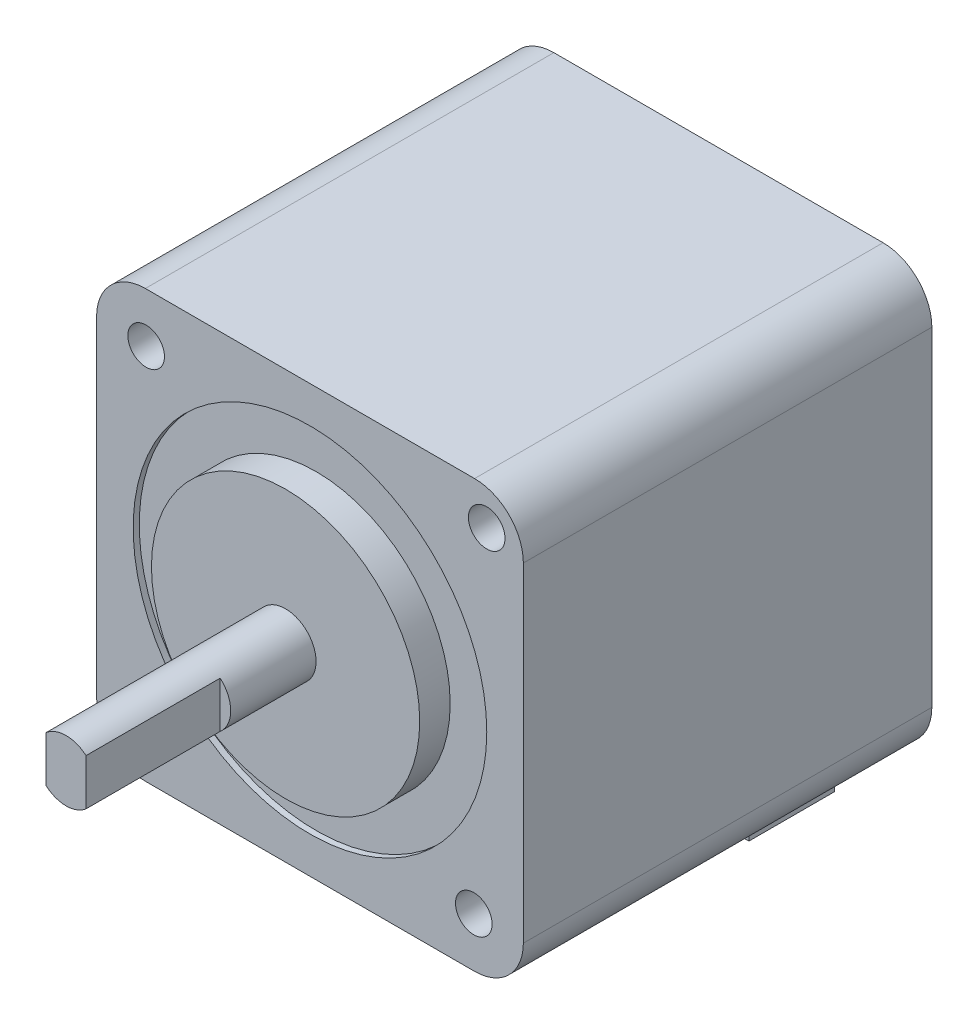
ISO-10303-21;
HEADER;
FILE_DESCRIPTION(('STEP AP214'),'2;1');
FILE_NAME('part.step','',(''),(''),'','','');
FILE_SCHEMA(('AUTOMOTIVE_DESIGN { 1 0 10303 214 1 1 1 1 }'));
ENDSEC;
DATA;
#1=APPLICATION_CONTEXT('core data for automotive mechanical design processes');
#2=APPLICATION_PROTOCOL_DEFINITION('international standard','automotive_design',2000,#1);
#3=PRODUCT_CONTEXT('',#1,'mechanical');
#4=PRODUCT('Part','Part','',(#3));
#5=PRODUCT_RELATED_PRODUCT_CATEGORY('part','',(#4));
#6=PRODUCT_DEFINITION_FORMATION('','',#4);
#7=PRODUCT_DEFINITION_CONTEXT('part definition',#1,'design');
#8=PRODUCT_DEFINITION('design','',#6,#7);
#9=PRODUCT_DEFINITION_SHAPE('','',#8);
#10=(LENGTH_UNIT() NAMED_UNIT(*) SI_UNIT(.MILLI.,.METRE.));
#11=(NAMED_UNIT(*) PLANE_ANGLE_UNIT() SI_UNIT($,.RADIAN.));
#12=(NAMED_UNIT(*) SI_UNIT($,.STERADIAN.) SOLID_ANGLE_UNIT());
#13=UNCERTAINTY_MEASURE_WITH_UNIT(LENGTH_MEASURE(1.E-05),#10,'distance_accuracy_value','');
#14=(GEOMETRIC_REPRESENTATION_CONTEXT(3) GLOBAL_UNCERTAINTY_ASSIGNED_CONTEXT((#13)) GLOBAL_UNIT_ASSIGNED_CONTEXT((#10,
#11,#12)) REPRESENTATION_CONTEXT('',''));
#15=CARTESIAN_POINT('',(0.,0.,0.));
#16=DIRECTION('',(0.,0.,1.));
#17=DIRECTION('',(1.,0.,0.));
#18=AXIS2_PLACEMENT_3D('',#15,#16,#17);
#19=CARTESIAN_POINT('',(-17.5,-17.5,33.5));
#20=DIRECTION('',(0.,1.,0.));
#21=DIRECTION('',(0.,0.,1.));
#22=AXIS2_PLACEMENT_3D('',#19,#20,#21);
#23=PLANE('',#22);
#24=DIRECTION('',(1.,0.,0.));
#25=VECTOR('',#24,1.);
#26=CARTESIAN_POINT('',(-17.5,-17.5,0.));
#27=LINE('',#26,#25);
#28=CARTESIAN_POINT('',(-13.5,-17.5,0.));
#29=VERTEX_POINT('',#28);
#30=CARTESIAN_POINT('',(13.5,-17.5,0.));
#31=VERTEX_POINT('',#30);
#32=EDGE_CURVE('E245',#29,#31,#27,.T.);
#33=ORIENTED_EDGE('',*,*,#32,.T.);
#34=DIRECTION('',(0.,0.,-1.));
#35=VECTOR('',#34,1.);
#36=CARTESIAN_POINT('',(13.5,-17.5,33.5));
#37=LINE('',#36,#35);
#38=CARTESIAN_POINT('',(13.5,-17.5,33.5));
#39=VERTEX_POINT('',#38);
#40=EDGE_CURVE('E11',#31,#39,#37,.F.);
#41=ORIENTED_EDGE('',*,*,#40,.T.);
#42=DIRECTION('',(1.,0.,0.));
#43=VECTOR('',#42,1.);
#44=CARTESIAN_POINT('',(-17.5,-17.5,33.5));
#45=LINE('',#44,#43);
#46=CARTESIAN_POINT('',(-13.5,-17.5,33.5));
#47=VERTEX_POINT('',#46);
#48=EDGE_CURVE('E251',#47,#39,#45,.T.);
#49=ORIENTED_EDGE('',*,*,#48,.F.);
#50=DIRECTION('',(0.,0.,-1.));
#51=VECTOR('',#50,1.);
#52=CARTESIAN_POINT('',(-13.5,-17.5,33.5));
#53=LINE('',#52,#51);
#54=EDGE_CURVE('E42',#47,#29,#53,.T.);
#55=ORIENTED_EDGE('',*,*,#54,.T.);
#56=EDGE_LOOP('',(#33,#41,#49,#55));
#57=FACE_BOUND('',#56,.T.);
#58=DIRECTION('',(0.,0.,1.));
#59=VECTOR('',#58,1.);
#60=CARTESIAN_POINT('',(10.5,-17.5,8.));
#61=LINE('',#60,#59);
#62=CARTESIAN_POINT('',(10.5,-17.5,1.));
#63=VERTEX_POINT('',#62);
#64=CARTESIAN_POINT('',(10.5,-17.5,8.));
#65=VERTEX_POINT('',#64);
#66=EDGE_CURVE('E166',#63,#65,#61,.T.);
#67=ORIENTED_EDGE('',*,*,#66,.F.);
#68=DIRECTION('',(1.,0.,0.));
#69=VECTOR('',#68,1.);
#70=CARTESIAN_POINT('',(-10.5,-17.5,1.));
#71=LINE('',#70,#69);
#72=CARTESIAN_POINT('',(-10.5,-17.5,1.));
#73=VERTEX_POINT('',#72);
#74=EDGE_CURVE('E163',#73,#63,#71,.T.);
#75=ORIENTED_EDGE('',*,*,#74,.F.);
#76=DIRECTION('',(0.,0.,-1.));
#77=VECTOR('',#76,1.);
#78=CARTESIAN_POINT('',(-10.5,-17.5,8.));
#79=LINE('',#78,#77);
#80=CARTESIAN_POINT('',(-10.5,-17.5,8.));
#81=VERTEX_POINT('',#80);
#82=EDGE_CURVE('E54',#81,#73,#79,.T.);
#83=ORIENTED_EDGE('',*,*,#82,.F.);
#84=DIRECTION('',(-1.,0.,0.));
#85=VECTOR('',#84,1.);
#86=CARTESIAN_POINT('',(-10.5,-17.5,8.));
#87=LINE('',#86,#85);
#88=EDGE_CURVE('E49',#65,#81,#87,.T.);
#89=ORIENTED_EDGE('',*,*,#88,.F.);
#90=EDGE_LOOP('',(#67,#75,#83,#89));
#91=FACE_BOUND('',#90,.T.);
#92=ADVANCED_FACE('F34',(#57,#91),#23,.F.);
#93=CARTESIAN_POINT('',(17.5,17.5,33.5));
#94=DIRECTION('',(-1.,0.,0.));
#95=DIRECTION('',(0.,-1.,0.));
#96=AXIS2_PLACEMENT_3D('',#93,#94,#95);
#97=PLANE('',#96);
#98=DIRECTION('',(0.,1.,0.));
#99=VECTOR('',#98,1.);
#100=CARTESIAN_POINT('',(17.5,17.5,0.));
#101=LINE('',#100,#99);
#102=CARTESIAN_POINT('',(17.5,-13.5,0.));
#103=VERTEX_POINT('',#102);
#104=CARTESIAN_POINT('',(17.5,13.5,0.));
#105=VERTEX_POINT('',#104);
#106=EDGE_CURVE('E240',#103,#105,#101,.T.);
#107=ORIENTED_EDGE('',*,*,#106,.T.);
#108=DIRECTION('',(0.,0.,-1.));
#109=VECTOR('',#108,1.);
#110=CARTESIAN_POINT('',(17.5,13.5,33.5));
#111=LINE('',#110,#109);
#112=CARTESIAN_POINT('',(17.5,13.5,33.5));
#113=VERTEX_POINT('',#112);
#114=EDGE_CURVE('E293',#105,#113,#111,.F.);
#115=ORIENTED_EDGE('',*,*,#114,.T.);
#116=DIRECTION('',(0.,1.,0.));
#117=VECTOR('',#116,1.);
#118=CARTESIAN_POINT('',(17.5,17.5,33.5));
#119=LINE('',#118,#117);
#120=CARTESIAN_POINT('',(17.5,-13.5,33.5));
#121=VERTEX_POINT('',#120);
#122=EDGE_CURVE('E241',#121,#113,#119,.T.);
#123=ORIENTED_EDGE('',*,*,#122,.F.);
#124=DIRECTION('',(0.,0.,-1.));
#125=VECTOR('',#124,1.);
#126=CARTESIAN_POINT('',(17.5,-13.5,33.5));
#127=LINE('',#126,#125);
#128=EDGE_CURVE('E290',#121,#103,#127,.T.);
#129=ORIENTED_EDGE('',*,*,#128,.T.);
#130=EDGE_LOOP('',(#107,#115,#123,#129));
#131=FACE_BOUND('',#130,.T.);
#132=ADVANCED_FACE('F312',(#131),#97,.F.);
#133=CARTESIAN_POINT('',(-17.5,17.5,33.5));
#134=DIRECTION('',(0.,-1.,0.));
#135=DIRECTION('',(0.,0.,-1.));
#136=AXIS2_PLACEMENT_3D('',#133,#134,#135);
#137=PLANE('',#136);
#138=DIRECTION('',(-1.,0.,0.));
#139=VECTOR('',#138,1.);
#140=CARTESIAN_POINT('',(-17.5,17.5,0.));
#141=LINE('',#140,#139);
#142=CARTESIAN_POINT('',(13.5,17.5,0.));
#143=VERTEX_POINT('',#142);
#144=CARTESIAN_POINT('',(-13.5,17.5,0.));
#145=VERTEX_POINT('',#144);
#146=EDGE_CURVE('E257',#143,#145,#141,.T.);
#147=ORIENTED_EDGE('',*,*,#146,.T.);
#148=DIRECTION('',(0.,0.,-1.));
#149=VECTOR('',#148,1.);
#150=CARTESIAN_POINT('',(-13.5,17.5,33.5));
#151=LINE('',#150,#149);
#152=CARTESIAN_POINT('',(-13.5,17.5,33.5));
#153=VERTEX_POINT('',#152);
#154=EDGE_CURVE('E280',#145,#153,#151,.F.);
#155=ORIENTED_EDGE('',*,*,#154,.T.);
#156=DIRECTION('',(-1.,0.,0.));
#157=VECTOR('',#156,1.);
#158=CARTESIAN_POINT('',(-17.5,17.5,33.5));
#159=LINE('',#158,#157);
#160=CARTESIAN_POINT('',(13.5,17.5,33.5));
#161=VERTEX_POINT('',#160);
#162=EDGE_CURVE('E244',#161,#153,#159,.T.);
#163=ORIENTED_EDGE('',*,*,#162,.F.);
#164=DIRECTION('',(0.,0.,-1.));
#165=VECTOR('',#164,1.);
#166=CARTESIAN_POINT('',(13.5,17.5,33.5));
#167=LINE('',#166,#165);
#168=EDGE_CURVE('E277',#161,#143,#167,.T.);
#169=ORIENTED_EDGE('',*,*,#168,.T.);
#170=EDGE_LOOP('',(#147,#155,#163,#169));
#171=FACE_BOUND('',#170,.T.);
#172=ADVANCED_FACE('F323',(#171),#137,.F.);
#173=CARTESIAN_POINT('',(-17.5,17.5,33.5));
#174=DIRECTION('',(1.,0.,0.));
#175=DIRECTION('',(0.,1.,0.));
#176=AXIS2_PLACEMENT_3D('',#173,#174,#175);
#177=PLANE('',#176);
#178=DIRECTION('',(0.,-1.,0.));
#179=VECTOR('',#178,1.);
#180=CARTESIAN_POINT('',(-17.5,17.5,33.5));
#181=LINE('',#180,#179);
#182=CARTESIAN_POINT('',(-17.5,13.5,33.5));
#183=VERTEX_POINT('',#182);
#184=CARTESIAN_POINT('',(-17.5,-13.5,33.5));
#185=VERTEX_POINT('',#184);
#186=EDGE_CURVE('E248',#183,#185,#181,.T.);
#187=ORIENTED_EDGE('',*,*,#186,.F.);
#188=DIRECTION('',(0.,0.,-1.));
#189=VECTOR('',#188,1.);
#190=CARTESIAN_POINT('',(-17.5,13.5,33.5));
#191=LINE('',#190,#189);
#192=CARTESIAN_POINT('',(-17.5,13.5,0.));
#193=VERTEX_POINT('',#192);
#194=EDGE_CURVE('E266',#183,#193,#191,.T.);
#195=ORIENTED_EDGE('',*,*,#194,.T.);
#196=DIRECTION('',(0.,-1.,0.));
#197=VECTOR('',#196,1.);
#198=CARTESIAN_POINT('',(-17.5,17.5,0.));
#199=LINE('',#198,#197);
#200=CARTESIAN_POINT('',(-17.5,-13.5,0.));
#201=VERTEX_POINT('',#200);
#202=EDGE_CURVE('E260',#193,#201,#199,.T.);
#203=ORIENTED_EDGE('',*,*,#202,.T.);
#204=DIRECTION('',(0.,0.,-1.));
#205=VECTOR('',#204,1.);
#206=CARTESIAN_POINT('',(-17.5,-13.5,33.5));
#207=LINE('',#206,#205);
#208=EDGE_CURVE('E254',#201,#185,#207,.F.);
#209=ORIENTED_EDGE('',*,*,#208,.T.);
#210=EDGE_LOOP('',(#187,#195,#203,#209));
#211=FACE_BOUND('',#210,.T.);
#212=ADVANCED_FACE('F331',(#211),#177,.F.);
#213=CARTESIAN_POINT('',(0.,0.,33.5));
#214=DIRECTION('',(0.,0.,1.));
#215=DIRECTION('',(1.,0.,0.));
#216=AXIS2_PLACEMENT_3D('',#213,#214,#215);
#217=PLANE('',#216);
#218=CARTESIAN_POINT('',(13.4350288425444,-13.4350288425444,33.5));
#219=DIRECTION('',(0.,0.,1.));
#220=DIRECTION('',(1.,0.,0.));
#221=AXIS2_PLACEMENT_3D('',#218,#219,#220);
#222=CIRCLE('',#221,1.5);
#223=CARTESIAN_POINT('',(14.9350288425444,-13.4350288425444,33.5));
#224=VERTEX_POINT('',#223);
#225=EDGE_CURVE('E201',#224,#224,#222,.T.);
#226=ORIENTED_EDGE('',*,*,#225,.F.);
#227=EDGE_LOOP('',(#226));
#228=FACE_BOUND('',#227,.T.);
#229=CARTESIAN_POINT('',(-13.4350288425444,13.4350288425444,33.5));
#230=DIRECTION('',(0.,0.,1.));
#231=DIRECTION('',(1.,0.,0.));
#232=AXIS2_PLACEMENT_3D('',#229,#230,#231);
#233=CIRCLE('',#232,1.5);
#234=CARTESIAN_POINT('',(-11.9350288425444,13.4350288425444,33.5));
#235=VERTEX_POINT('',#234);
#236=EDGE_CURVE('E209',#235,#235,#233,.T.);
#237=ORIENTED_EDGE('',*,*,#236,.F.);
#238=EDGE_LOOP('',(#237));
#239=FACE_BOUND('',#238,.T.);
#240=CARTESIAN_POINT('',(-14.4956890143241,-14.4956890143243,33.5));
#241=DIRECTION('',(0.,0.,1.));
#242=DIRECTION('',(1.,0.,0.));
#243=AXIS2_PLACEMENT_3D('',#240,#241,#242);
#244=CIRCLE('',#243,1.5);
#245=CARTESIAN_POINT('',(-12.9956890143241,-14.4956890143243,33.5));
#246=VERTEX_POINT('',#245);
#247=EDGE_CURVE('E208',#246,#246,#244,.T.);
#248=ORIENTED_EDGE('',*,*,#247,.F.);
#249=EDGE_LOOP('',(#248));
#250=FACE_BOUND('',#249,.T.);
#251=CARTESIAN_POINT('',(14.4956890143241,14.4956890143243,33.5));
#252=DIRECTION('',(0.,0.,1.));
#253=DIRECTION('',(1.,0.,0.));
#254=AXIS2_PLACEMENT_3D('',#251,#252,#253);
#255=CIRCLE('',#254,1.50000000000001);
#256=CARTESIAN_POINT('',(15.9956890143241,14.4956890143243,33.5));
#257=VERTEX_POINT('',#256);
#258=EDGE_CURVE('E220',#257,#257,#255,.T.);
#259=ORIENTED_EDGE('',*,*,#258,.F.);
#260=EDGE_LOOP('',(#259));
#261=FACE_BOUND('',#260,.T.);
#262=CARTESIAN_POINT('',(0.,0.,33.5));
#263=DIRECTION('',(0.,0.,1.));
#264=DIRECTION('',(1.,0.,0.));
#265=AXIS2_PLACEMENT_3D('',#262,#263,#264);
#266=CIRCLE('',#265,14.5);
#267=CARTESIAN_POINT('',(14.5,0.,33.5));
#268=VERTEX_POINT('',#267);
#269=EDGE_CURVE('E231',#268,#268,#266,.T.);
#270=ORIENTED_EDGE('',*,*,#269,.F.);
#271=EDGE_LOOP('',(#270));
#272=FACE_BOUND('',#271,.T.);
#273=ORIENTED_EDGE('',*,*,#162,.T.);
#274=CARTESIAN_POINT('',(-13.5,13.5,33.5));
#275=DIRECTION('',(0.,0.,1.));
#276=DIRECTION('',(1.,0.,0.));
#277=AXIS2_PLACEMENT_3D('',#274,#275,#276);
#278=CIRCLE('',#277,4.);
#279=EDGE_CURVE('E288',#153,#183,#278,.T.);
#280=ORIENTED_EDGE('',*,*,#279,.T.);
#281=ORIENTED_EDGE('',*,*,#186,.T.);
#282=CARTESIAN_POINT('',(-13.5,-13.5,33.5));
#283=DIRECTION('',(0.,0.,1.));
#284=DIRECTION('',(1.,0.,0.));
#285=AXIS2_PLACEMENT_3D('',#282,#283,#284);
#286=CIRCLE('',#285,4.);
#287=EDGE_CURVE('E282',#185,#47,#286,.T.);
#288=ORIENTED_EDGE('',*,*,#287,.T.);
#289=ORIENTED_EDGE('',*,*,#48,.T.);
#290=CARTESIAN_POINT('',(13.5,-13.5,33.5));
#291=DIRECTION('',(0.,0.,1.));
#292=DIRECTION('',(1.,0.,0.));
#293=AXIS2_PLACEMENT_3D('',#290,#291,#292);
#294=CIRCLE('',#293,4.);
#295=EDGE_CURVE('E284',#39,#121,#294,.T.);
#296=ORIENTED_EDGE('',*,*,#295,.T.);
#297=ORIENTED_EDGE('',*,*,#122,.T.);
#298=CARTESIAN_POINT('',(13.5,13.5,33.5));
#299=DIRECTION('',(0.,0.,1.));
#300=DIRECTION('',(1.,0.,0.));
#301=AXIS2_PLACEMENT_3D('',#298,#299,#300);
#302=CIRCLE('',#301,4.);
#303=EDGE_CURVE('E286',#113,#161,#302,.T.);
#304=ORIENTED_EDGE('',*,*,#303,.T.);
#305=EDGE_LOOP('',(#273,#280,#281,#288,#289,#296,#297,#304));
#306=FACE_BOUND('',#305,.T.);
#307=ADVANCED_FACE('F316',(#228,#239,#250,#261,#272,#306),#217,.T.);
#308=CARTESIAN_POINT('',(0.,0.,0.));
#309=DIRECTION('',(0.,0.,1.));
#310=DIRECTION('',(1.,0.,0.));
#311=AXIS2_PLACEMENT_3D('',#308,#309,#310);
#312=PLANE('',#311);
#313=ORIENTED_EDGE('',*,*,#202,.F.);
#314=CARTESIAN_POINT('',(-13.5,13.5,0.));
#315=DIRECTION('',(0.,0.,1.));
#316=DIRECTION('',(1.,0.,0.));
#317=AXIS2_PLACEMENT_3D('',#314,#315,#316);
#318=CIRCLE('',#317,4.);
#319=EDGE_CURVE('E275',#193,#145,#318,.F.);
#320=ORIENTED_EDGE('',*,*,#319,.T.);
#321=ORIENTED_EDGE('',*,*,#146,.F.);
#322=CARTESIAN_POINT('',(13.5,13.5,0.));
#323=DIRECTION('',(0.,0.,1.));
#324=DIRECTION('',(1.,0.,0.));
#325=AXIS2_PLACEMENT_3D('',#322,#323,#324);
#326=CIRCLE('',#325,4.);
#327=EDGE_CURVE('E273',#143,#105,#326,.F.);
#328=ORIENTED_EDGE('',*,*,#327,.T.);
#329=ORIENTED_EDGE('',*,*,#106,.F.);
#330=CARTESIAN_POINT('',(13.5,-13.5,0.));
#331=DIRECTION('',(0.,0.,1.));
#332=DIRECTION('',(1.,0.,0.));
#333=AXIS2_PLACEMENT_3D('',#330,#331,#332);
#334=CIRCLE('',#333,4.);
#335=EDGE_CURVE('E271',#103,#31,#334,.F.);
#336=ORIENTED_EDGE('',*,*,#335,.T.);
#337=ORIENTED_EDGE('',*,*,#32,.F.);
#338=CARTESIAN_POINT('',(-13.5,-13.5,0.));
#339=DIRECTION('',(0.,0.,1.));
#340=DIRECTION('',(1.,0.,0.));
#341=AXIS2_PLACEMENT_3D('',#338,#339,#340);
#342=CIRCLE('',#341,4.);
#343=EDGE_CURVE('E269',#29,#201,#342,.F.);
#344=ORIENTED_EDGE('',*,*,#343,.T.);
#345=EDGE_LOOP('',(#313,#320,#321,#328,#329,#336,#337,#344));
#346=FACE_BOUND('',#345,.T.);
#347=ADVANCED_FACE('F304',(#346),#312,.F.);
#348=CARTESIAN_POINT('',(0.,0.,33.));
#349=DIRECTION('',(0.,0.,1.));
#350=DIRECTION('',(1.,0.,0.));
#351=AXIS2_PLACEMENT_3D('',#348,#349,#350);
#352=CYLINDRICAL_SURFACE('',#351,14.5);
#353=CARTESIAN_POINT('',(0.,0.,33.));
#354=DIRECTION('',(0.,0.,1.));
#355=DIRECTION('',(1.,0.,0.));
#356=AXIS2_PLACEMENT_3D('',#353,#354,#355);
#357=CIRCLE('',#356,14.5);
#358=CARTESIAN_POINT('',(14.5,0.,33.));
#359=VERTEX_POINT('',#358);
#360=EDGE_CURVE('E232',#359,#359,#357,.T.);
#361=ORIENTED_EDGE('',*,*,#360,.F.);
#362=EDGE_LOOP('',(#361));
#363=FACE_BOUND('',#362,.T.);
#364=ORIENTED_EDGE('',*,*,#269,.T.);
#365=EDGE_LOOP('',(#364));
#366=FACE_BOUND('',#365,.T.);
#367=ADVANCED_FACE('F596',(#363,#366),#352,.F.);
#368=CARTESIAN_POINT('',(0.,0.,33.));
#369=DIRECTION('',(0.,0.,1.));
#370=DIRECTION('',(1.,0.,0.));
#371=AXIS2_PLACEMENT_3D('',#368,#369,#370);
#372=PLANE('',#371);
#373=CARTESIAN_POINT('',(0.,0.,33.));
#374=DIRECTION('',(0.,0.,1.));
#375=DIRECTION('',(1.,0.,0.));
#376=AXIS2_PLACEMENT_3D('',#373,#374,#375);
#377=CIRCLE('',#376,11.);
#378=CARTESIAN_POINT('',(11.,0.,33.));
#379=VERTEX_POINT('',#378);
#380=EDGE_CURVE('E226',#379,#379,#377,.T.);
#381=ORIENTED_EDGE('',*,*,#380,.F.);
#382=EDGE_LOOP('',(#381));
#383=FACE_BOUND('',#382,.T.);
#384=ORIENTED_EDGE('',*,*,#360,.T.);
#385=EDGE_LOOP('',(#384));
#386=FACE_BOUND('',#385,.T.);
#387=ADVANCED_FACE('F471',(#383,#386),#372,.T.);
#388=CARTESIAN_POINT('',(0.,0.,35.5));
#389=DIRECTION('',(0.,0.,1.));
#390=DIRECTION('',(1.,0.,0.));
#391=AXIS2_PLACEMENT_3D('',#388,#389,#390);
#392=PLANE('',#391);
#393=CARTESIAN_POINT('',(0.,0.,35.5));
#394=DIRECTION('',(0.,0.,1.));
#395=DIRECTION('',(1.,0.,0.));
#396=AXIS2_PLACEMENT_3D('',#393,#394,#395);
#397=CIRCLE('',#396,2.5);
#398=CARTESIAN_POINT('',(2.5,0.,35.5));
#399=VERTEX_POINT('',#398);
#400=EDGE_CURVE('E196',#399,#399,#397,.T.);
#401=ORIENTED_EDGE('',*,*,#400,.F.);
#402=EDGE_LOOP('',(#401));
#403=FACE_BOUND('',#402,.T.);
#404=CARTESIAN_POINT('',(0.,0.,35.5));
#405=DIRECTION('',(0.,0.,1.));
#406=DIRECTION('',(1.,0.,0.));
#407=AXIS2_PLACEMENT_3D('',#404,#405,#406);
#408=CIRCLE('',#407,11.);
#409=CARTESIAN_POINT('',(11.,0.,35.5));
#410=VERTEX_POINT('',#409);
#411=EDGE_CURVE('E235',#410,#410,#408,.T.);
#412=ORIENTED_EDGE('',*,*,#411,.T.);
#413=EDGE_LOOP('',(#412));
#414=FACE_BOUND('',#413,.T.);
#415=ADVANCED_FACE('F466',(#403,#414),#392,.T.);
#416=CARTESIAN_POINT('',(0.,0.,35.5));
#417=DIRECTION('',(0.,0.,-1.));
#418=DIRECTION('',(-1.,0.,0.));
#419=AXIS2_PLACEMENT_3D('',#416,#417,#418);
#420=CYLINDRICAL_SURFACE('',#419,11.);
#421=ORIENTED_EDGE('',*,*,#411,.F.);
#422=EDGE_LOOP('',(#421));
#423=FACE_BOUND('',#422,.T.);
#424=ORIENTED_EDGE('',*,*,#380,.T.);
#425=EDGE_LOOP('',(#424));
#426=FACE_BOUND('',#425,.T.);
#427=ADVANCED_FACE('F357',(#423,#426),#420,.T.);
#428=CARTESIAN_POINT('',(-13.5,13.5,33.5));
#429=DIRECTION('',(0.,0.,-1.));
#430=DIRECTION('',(-1.,0.,0.));
#431=AXIS2_PLACEMENT_3D('',#428,#429,#430);
#432=CYLINDRICAL_SURFACE('',#431,4.);
#433=ORIENTED_EDGE('',*,*,#279,.F.);
#434=ORIENTED_EDGE('',*,*,#154,.F.);
#435=ORIENTED_EDGE('',*,*,#319,.F.);
#436=ORIENTED_EDGE('',*,*,#194,.F.);
#437=EDGE_LOOP('',(#433,#434,#435,#436));
#438=FACE_BOUND('',#437,.T.);
#439=ADVANCED_FACE('F328',(#438),#432,.T.);
#440=CARTESIAN_POINT('',(13.5,13.5,33.5));
#441=DIRECTION('',(0.,0.,-1.));
#442=DIRECTION('',(-1.,0.,0.));
#443=AXIS2_PLACEMENT_3D('',#440,#441,#442);
#444=CYLINDRICAL_SURFACE('',#443,4.);
#445=ORIENTED_EDGE('',*,*,#303,.F.);
#446=ORIENTED_EDGE('',*,*,#114,.F.);
#447=ORIENTED_EDGE('',*,*,#327,.F.);
#448=ORIENTED_EDGE('',*,*,#168,.F.);
#449=EDGE_LOOP('',(#445,#446,#447,#448));
#450=FACE_BOUND('',#449,.T.);
#451=ADVANCED_FACE('F320',(#450),#444,.T.);
#452=CARTESIAN_POINT('',(13.5,-13.5,33.5));
#453=DIRECTION('',(0.,0.,-1.));
#454=DIRECTION('',(-1.,0.,0.));
#455=AXIS2_PLACEMENT_3D('',#452,#453,#454);
#456=CYLINDRICAL_SURFACE('',#455,4.);
#457=ORIENTED_EDGE('',*,*,#295,.F.);
#458=ORIENTED_EDGE('',*,*,#40,.F.);
#459=ORIENTED_EDGE('',*,*,#335,.F.);
#460=ORIENTED_EDGE('',*,*,#128,.F.);
#461=EDGE_LOOP('',(#457,#458,#459,#460));
#462=FACE_BOUND('',#461,.T.);
#463=ADVANCED_FACE('F309',(#462),#456,.T.);
#464=CARTESIAN_POINT('',(-13.5,-13.5,33.5));
#465=DIRECTION('',(0.,0.,-1.));
#466=DIRECTION('',(-1.,0.,0.));
#467=AXIS2_PLACEMENT_3D('',#464,#465,#466);
#468=CYLINDRICAL_SURFACE('',#467,4.);
#469=ORIENTED_EDGE('',*,*,#287,.F.);
#470=ORIENTED_EDGE('',*,*,#208,.F.);
#471=ORIENTED_EDGE('',*,*,#343,.F.);
#472=ORIENTED_EDGE('',*,*,#54,.F.);
#473=EDGE_LOOP('',(#469,#470,#471,#472));
#474=FACE_BOUND('',#473,.T.);
#475=ADVANCED_FACE('F36',(#474),#468,.T.);
#476=CARTESIAN_POINT('',(14.4956890143241,14.4956890143243,28.5));
#477=DIRECTION('',(0.,0.,1.));
#478=DIRECTION('',(1.,0.,0.));
#479=AXIS2_PLACEMENT_3D('',#476,#477,#478);
#480=CYLINDRICAL_SURFACE('',#479,1.50000000000001);
#481=CARTESIAN_POINT('',(14.4956890143241,14.4956890143243,28.5));
#482=DIRECTION('',(0.,0.,1.));
#483=DIRECTION('',(1.,0.,0.));
#484=AXIS2_PLACEMENT_3D('',#481,#482,#483);
#485=CIRCLE('',#484,1.50000000000001);
#486=CARTESIAN_POINT('',(15.9956890143241,14.4956890143243,28.5));
#487=VERTEX_POINT('',#486);
#488=EDGE_CURVE('E223',#487,#487,#485,.T.);
#489=ORIENTED_EDGE('',*,*,#488,.F.);
#490=EDGE_LOOP('',(#489));
#491=FACE_BOUND('',#490,.T.);
#492=ORIENTED_EDGE('',*,*,#258,.T.);
#493=EDGE_LOOP('',(#492));
#494=FACE_BOUND('',#493,.T.);
#495=ADVANCED_FACE('F334',(#491,#494),#480,.F.);
#496=CARTESIAN_POINT('',(14.4956890143241,14.4956890143243,28.5));
#497=DIRECTION('',(0.,0.,1.));
#498=DIRECTION('',(1.,0.,0.));
#499=AXIS2_PLACEMENT_3D('',#496,#497,#498);
#500=PLANE('',#499);
#501=ORIENTED_EDGE('',*,*,#488,.T.);
#502=EDGE_LOOP('',(#501));
#503=FACE_BOUND('',#502,.T.);
#504=ADVANCED_FACE('F339',(#503),#500,.T.);
#505=CARTESIAN_POINT('',(-14.4956890143241,-14.4956890143243,28.5));
#506=DIRECTION('',(0.,0.,1.));
#507=DIRECTION('',(1.,0.,0.));
#508=AXIS2_PLACEMENT_3D('',#505,#506,#507);
#509=CYLINDRICAL_SURFACE('',#508,1.5);
#510=CARTESIAN_POINT('',(-14.4956890143241,-14.4956890143243,28.5));
#511=DIRECTION('',(0.,0.,1.));
#512=DIRECTION('',(1.,0.,0.));
#513=AXIS2_PLACEMENT_3D('',#510,#511,#512);
#514=CIRCLE('',#513,1.5);
#515=CARTESIAN_POINT('',(-12.9956890143241,-14.4956890143243,28.5));
#516=VERTEX_POINT('',#515);
#517=EDGE_CURVE('E217',#516,#516,#514,.T.);
#518=ORIENTED_EDGE('',*,*,#517,.F.);
#519=EDGE_LOOP('',(#518));
#520=FACE_BOUND('',#519,.T.);
#521=ORIENTED_EDGE('',*,*,#247,.T.);
#522=EDGE_LOOP('',(#521));
#523=FACE_BOUND('',#522,.T.);
#524=ADVANCED_FACE('F398',(#520,#523),#509,.F.);
#525=CARTESIAN_POINT('',(-14.4956890143241,-14.4956890143243,28.5));
#526=DIRECTION('',(0.,0.,1.));
#527=DIRECTION('',(1.,0.,0.));
#528=AXIS2_PLACEMENT_3D('',#525,#526,#527);
#529=PLANE('',#528);
#530=ORIENTED_EDGE('',*,*,#517,.T.);
#531=EDGE_LOOP('',(#530));
#532=FACE_BOUND('',#531,.T.);
#533=ADVANCED_FACE('F408',(#532),#529,.T.);
#534=CARTESIAN_POINT('',(-13.4350288425444,13.4350288425444,28.5));
#535=DIRECTION('',(0.,0.,1.));
#536=DIRECTION('',(1.,0.,0.));
#537=AXIS2_PLACEMENT_3D('',#534,#535,#536);
#538=CYLINDRICAL_SURFACE('',#537,1.5);
#539=CARTESIAN_POINT('',(-13.4350288425444,13.4350288425444,28.5));
#540=DIRECTION('',(0.,0.,1.));
#541=DIRECTION('',(1.,0.,0.));
#542=AXIS2_PLACEMENT_3D('',#539,#540,#541);
#543=CIRCLE('',#542,1.5);
#544=CARTESIAN_POINT('',(-11.9350288425444,13.4350288425444,28.5));
#545=VERTEX_POINT('',#544);
#546=EDGE_CURVE('E205',#545,#545,#543,.T.);
#547=ORIENTED_EDGE('',*,*,#546,.F.);
#548=EDGE_LOOP('',(#547));
#549=FACE_BOUND('',#548,.T.);
#550=ORIENTED_EDGE('',*,*,#236,.T.);
#551=EDGE_LOOP('',(#550));
#552=FACE_BOUND('',#551,.T.);
#553=ADVANCED_FACE('F418',(#549,#552),#538,.F.);
#554=CARTESIAN_POINT('',(-13.4350288425444,13.4350288425444,28.5));
#555=DIRECTION('',(0.,0.,1.));
#556=DIRECTION('',(1.,0.,0.));
#557=AXIS2_PLACEMENT_3D('',#554,#555,#556);
#558=PLANE('',#557);
#559=ORIENTED_EDGE('',*,*,#546,.T.);
#560=EDGE_LOOP('',(#559));
#561=FACE_BOUND('',#560,.T.);
#562=ADVANCED_FACE('F428',(#561),#558,.T.);
#563=CARTESIAN_POINT('',(13.4350288425444,-13.4350288425444,28.5));
#564=DIRECTION('',(0.,0.,1.));
#565=DIRECTION('',(1.,0.,0.));
#566=AXIS2_PLACEMENT_3D('',#563,#564,#565);
#567=CYLINDRICAL_SURFACE('',#566,1.5);
#568=CARTESIAN_POINT('',(13.4350288425444,-13.4350288425444,28.5));
#569=DIRECTION('',(0.,0.,1.));
#570=DIRECTION('',(1.,0.,0.));
#571=AXIS2_PLACEMENT_3D('',#568,#569,#570);
#572=CIRCLE('',#571,1.5);
#573=CARTESIAN_POINT('',(14.9350288425444,-13.4350288425444,28.5));
#574=VERTEX_POINT('',#573);
#575=EDGE_CURVE('E212',#574,#574,#572,.T.);
#576=ORIENTED_EDGE('',*,*,#575,.F.);
#577=EDGE_LOOP('',(#576));
#578=FACE_BOUND('',#577,.T.);
#579=ORIENTED_EDGE('',*,*,#225,.T.);
#580=EDGE_LOOP('',(#579));
#581=FACE_BOUND('',#580,.T.);
#582=ADVANCED_FACE('F438',(#578,#581),#567,.F.);
#583=CARTESIAN_POINT('',(13.4350288425444,-13.4350288425444,28.5));
#584=DIRECTION('',(0.,0.,1.));
#585=DIRECTION('',(1.,0.,0.));
#586=AXIS2_PLACEMENT_3D('',#583,#584,#585);
#587=PLANE('',#586);
#588=ORIENTED_EDGE('',*,*,#575,.T.);
#589=EDGE_LOOP('',(#588));
#590=FACE_BOUND('',#589,.T.);
#591=ADVANCED_FACE('F448',(#590),#587,.T.);
#592=CARTESIAN_POINT('',(0.,0.,53.5));
#593=DIRECTION('',(0.,0.,-1.));
#594=DIRECTION('',(-1.,0.,0.));
#595=AXIS2_PLACEMENT_3D('',#592,#593,#594);
#596=CYLINDRICAL_SURFACE('',#595,2.5);
#597=CARTESIAN_POINT('',(0.,0.,53.5));
#598=DIRECTION('',(0.,0.,1.));
#599=DIRECTION('',(1.,0.,0.));
#600=AXIS2_PLACEMENT_3D('',#597,#598,#599);
#601=CIRCLE('',#600,2.5);
#602=CARTESIAN_POINT('',(-1.63546217987554,-1.8908367084962,53.5));
#603=VERTEX_POINT('',#602);
#604=CARTESIAN_POINT('',(1.63546217987554,-1.8908367084962,53.5));
#605=VERTEX_POINT('',#604);
#606=EDGE_CURVE('E202',#603,#605,#601,.T.);
#607=ORIENTED_EDGE('',*,*,#606,.F.);
#608=DIRECTION('',(0.,0.,1.));
#609=VECTOR('',#608,1.);
#610=CARTESIAN_POINT('',(-1.63546217987554,-1.8908367084962,42.5));
#611=LINE('',#610,#609);
#612=CARTESIAN_POINT('',(-1.63546217987554,-1.8908367084962,42.5));
#613=VERTEX_POINT('',#612);
#614=EDGE_CURVE('E178',#613,#603,#611,.T.);
#615=ORIENTED_EDGE('',*,*,#614,.F.);
#616=CARTESIAN_POINT('',(0.,0.,42.5));
#617=DIRECTION('',(0.,0.,1.));
#618=DIRECTION('',(1.,0.,0.));
#619=AXIS2_PLACEMENT_3D('',#616,#617,#618);
#620=CIRCLE('',#619,2.5);
#621=CARTESIAN_POINT('',(-1.63546217987554,1.8908367084962,42.5));
#622=VERTEX_POINT('',#621);
#623=EDGE_CURVE('E169',#622,#613,#620,.T.);
#624=ORIENTED_EDGE('',*,*,#623,.F.);
#625=DIRECTION('',(0.,0.,1.));
#626=VECTOR('',#625,1.);
#627=CARTESIAN_POINT('',(-1.63546217987554,1.8908367084962,42.5));
#628=LINE('',#627,#626);
#629=CARTESIAN_POINT('',(-1.63546217987554,1.8908367084962,53.5));
#630=VERTEX_POINT('',#629);
#631=EDGE_CURVE('E180',#622,#630,#628,.T.);
#632=ORIENTED_EDGE('',*,*,#631,.T.);
#633=CARTESIAN_POINT('',(1.63546217987554,1.8908367084962,53.5));
#634=VERTEX_POINT('',#633);
#635=EDGE_CURVE('E198',#634,#630,#601,.T.);
#636=ORIENTED_EDGE('',*,*,#635,.F.);
#637=DIRECTION('',(0.,0.,1.));
#638=VECTOR('',#637,1.);
#639=CARTESIAN_POINT('',(1.63546217987554,1.8908367084962,42.5));
#640=LINE('',#639,#638);
#641=CARTESIAN_POINT('',(1.63546217987554,1.8908367084962,42.5));
#642=VERTEX_POINT('',#641);
#643=EDGE_CURVE('E190',#642,#634,#640,.T.);
#644=ORIENTED_EDGE('',*,*,#643,.F.);
#645=CARTESIAN_POINT('',(0.,0.,42.5));
#646=DIRECTION('',(0.,0.,1.));
#647=DIRECTION('',(1.,0.,0.));
#648=AXIS2_PLACEMENT_3D('',#645,#646,#647);
#649=CIRCLE('',#648,2.5);
#650=CARTESIAN_POINT('',(1.63546217987554,-1.8908367084962,42.5));
#651=VERTEX_POINT('',#650);
#652=EDGE_CURVE('E185',#651,#642,#649,.T.);
#653=ORIENTED_EDGE('',*,*,#652,.F.);
#654=DIRECTION('',(0.,0.,1.));
#655=VECTOR('',#654,1.);
#656=CARTESIAN_POINT('',(1.63546217987554,-1.8908367084962,42.5));
#657=LINE('',#656,#655);
#658=EDGE_CURVE('E193',#651,#605,#657,.T.);
#659=ORIENTED_EDGE('',*,*,#658,.T.);
#660=EDGE_LOOP('',(#607,#615,#624,#632,#636,#644,#653,#659));
#661=FACE_BOUND('',#660,.T.);
#662=ORIENTED_EDGE('',*,*,#400,.T.);
#663=EDGE_LOOP('',(#662));
#664=FACE_BOUND('',#663,.T.);
#665=ADVANCED_FACE('F458',(#661,#664),#596,.T.);
#666=CARTESIAN_POINT('',(0.,0.,53.5));
#667=DIRECTION('',(0.,0.,1.));
#668=DIRECTION('',(1.,0.,0.));
#669=AXIS2_PLACEMENT_3D('',#666,#667,#668);
#670=PLANE('',#669);
#671=DIRECTION('',(0.,1.,0.));
#672=VECTOR('',#671,1.);
#673=CARTESIAN_POINT('',(-1.63546217987554,1.8908367084962,53.5));
#674=LINE('',#673,#672);
#675=EDGE_CURVE('E167',#603,#630,#674,.T.);
#676=ORIENTED_EDGE('',*,*,#675,.F.);
#677=ORIENTED_EDGE('',*,*,#606,.T.);
#678=DIRECTION('',(0.,-1.,0.));
#679=VECTOR('',#678,1.);
#680=CARTESIAN_POINT('',(1.63546217987554,1.8908367084962,53.5));
#681=LINE('',#680,#679);
#682=EDGE_CURVE('E183',#634,#605,#681,.T.);
#683=ORIENTED_EDGE('',*,*,#682,.F.);
#684=ORIENTED_EDGE('',*,*,#635,.T.);
#685=EDGE_LOOP('',(#676,#677,#683,#684));
#686=FACE_BOUND('',#685,.T.);
#687=ADVANCED_FACE('F482',(#686),#670,.T.);
#688=CARTESIAN_POINT('',(1.63546217987554,1.8908367084962,42.5));
#689=DIRECTION('',(-1.,0.,0.));
#690=DIRECTION('',(0.,0.,1.));
#691=AXIS2_PLACEMENT_3D('',#688,#689,#690);
#692=PLANE('',#691);
#693=ORIENTED_EDGE('',*,*,#682,.T.);
#694=ORIENTED_EDGE('',*,*,#658,.F.);
#695=DIRECTION('',(0.,-1.,0.));
#696=VECTOR('',#695,1.);
#697=CARTESIAN_POINT('',(1.63546217987554,1.8908367084962,42.5));
#698=LINE('',#697,#696);
#699=EDGE_CURVE('E187',#642,#651,#698,.T.);
#700=ORIENTED_EDGE('',*,*,#699,.F.);
#701=ORIENTED_EDGE('',*,*,#643,.T.);
#702=EDGE_LOOP('',(#693,#694,#700,#701));
#703=FACE_BOUND('',#702,.T.);
#704=ADVANCED_FACE('F492',(#703),#692,.F.);
#705=CARTESIAN_POINT('',(0.,0.,42.5));
#706=DIRECTION('',(0.,0.,1.));
#707=DIRECTION('',(1.,0.,0.));
#708=AXIS2_PLACEMENT_3D('',#705,#706,#707);
#709=PLANE('',#708);
#710=ORIENTED_EDGE('',*,*,#652,.T.);
#711=ORIENTED_EDGE('',*,*,#699,.T.);
#712=EDGE_LOOP('',(#710,#711));
#713=FACE_BOUND('',#712,.T.);
#714=ADVANCED_FACE('F502',(#713),#709,.T.);
#715=CARTESIAN_POINT('',(-1.63546217987554,1.8908367084962,42.5));
#716=DIRECTION('',(1.,0.,0.));
#717=DIRECTION('',(0.,0.,-1.));
#718=AXIS2_PLACEMENT_3D('',#715,#716,#717);
#719=PLANE('',#718);
#720=ORIENTED_EDGE('',*,*,#675,.T.);
#721=ORIENTED_EDGE('',*,*,#631,.F.);
#722=DIRECTION('',(0.,1.,0.));
#723=VECTOR('',#722,1.);
#724=CARTESIAN_POINT('',(-1.63546217987554,1.8908367084962,42.5));
#725=LINE('',#724,#723);
#726=EDGE_CURVE('E176',#613,#622,#725,.T.);
#727=ORIENTED_EDGE('',*,*,#726,.F.);
#728=ORIENTED_EDGE('',*,*,#614,.T.);
#729=EDGE_LOOP('',(#720,#721,#727,#728));
#730=FACE_BOUND('',#729,.T.);
#731=ADVANCED_FACE('F512',(#730),#719,.F.);
#732=CARTESIAN_POINT('',(0.,0.,42.5));
#733=DIRECTION('',(0.,0.,1.));
#734=DIRECTION('',(1.,0.,0.));
#735=AXIS2_PLACEMENT_3D('',#732,#733,#734);
#736=PLANE('',#735);
#737=ORIENTED_EDGE('',*,*,#623,.T.);
#738=ORIENTED_EDGE('',*,*,#726,.T.);
#739=EDGE_LOOP('',(#737,#738));
#740=FACE_BOUND('',#739,.T.);
#741=ADVANCED_FACE('F522',(#740),#736,.T.);
#742=CARTESIAN_POINT('',(10.5,-22.5,8.));
#743=DIRECTION('',(-1.,0.,0.));
#744=DIRECTION('',(0.,0.,1.));
#745=AXIS2_PLACEMENT_3D('',#742,#743,#744);
#746=PLANE('',#745);
#747=ORIENTED_EDGE('',*,*,#66,.T.);
#748=DIRECTION('',(0.,1.,0.));
#749=VECTOR('',#748,1.);
#750=CARTESIAN_POINT('',(10.5,-22.5,8.));
#751=LINE('',#750,#749);
#752=CARTESIAN_POINT('',(10.5,-22.5,8.));
#753=VERTEX_POINT('',#752);
#754=EDGE_CURVE('E147',#753,#65,#751,.T.);
#755=ORIENTED_EDGE('',*,*,#754,.F.);
#756=DIRECTION('',(0.,0.,1.));
#757=VECTOR('',#756,1.);
#758=CARTESIAN_POINT('',(10.5,-22.5,8.));
#759=LINE('',#758,#757);
#760=CARTESIAN_POINT('',(10.5,-22.5,1.));
#761=VERTEX_POINT('',#760);
#762=EDGE_CURVE('E154',#761,#753,#759,.T.);
#763=ORIENTED_EDGE('',*,*,#762,.F.);
#764=DIRECTION('',(0.,1.,0.));
#765=VECTOR('',#764,1.);
#766=CARTESIAN_POINT('',(10.5,-22.5,1.));
#767=LINE('',#766,#765);
#768=EDGE_CURVE('E660',#761,#63,#767,.T.);
#769=ORIENTED_EDGE('',*,*,#768,.T.);
#770=EDGE_LOOP('',(#747,#755,#763,#769));
#771=FACE_BOUND('',#770,.T.);
#772=ADVANCED_FACE('F165',(#771),#746,.F.);
#773=CARTESIAN_POINT('',(-10.5,-22.5,8.));
#774=DIRECTION('',(0.,0.,-1.));
#775=DIRECTION('',(-1.,0.,0.));
#776=AXIS2_PLACEMENT_3D('',#773,#774,#775);
#777=PLANE('',#776);
#778=ORIENTED_EDGE('',*,*,#88,.T.);
#779=DIRECTION('',(0.,1.,0.));
#780=VECTOR('',#779,1.);
#781=CARTESIAN_POINT('',(-10.5,-22.5,8.));
#782=LINE('',#781,#780);
#783=CARTESIAN_POINT('',(-10.5,-22.5,8.));
#784=VERTEX_POINT('',#783);
#785=EDGE_CURVE('E150',#784,#81,#782,.T.);
#786=ORIENTED_EDGE('',*,*,#785,.F.);
#787=DIRECTION('',(-1.,0.,0.));
#788=VECTOR('',#787,1.);
#789=CARTESIAN_POINT('',(-10.5,-22.5,8.));
#790=LINE('',#789,#788);
#791=EDGE_CURVE('E143',#753,#784,#790,.T.);
#792=ORIENTED_EDGE('',*,*,#791,.F.);
#793=ORIENTED_EDGE('',*,*,#754,.T.);
#794=EDGE_LOOP('',(#778,#786,#792,#793));
#795=FACE_BOUND('',#794,.T.);
#796=ADVANCED_FACE('F145',(#795),#777,.F.);
#797=CARTESIAN_POINT('',(-10.5,-22.5,8.));
#798=DIRECTION('',(1.,0.,0.));
#799=DIRECTION('',(0.,0.,-1.));
#800=AXIS2_PLACEMENT_3D('',#797,#798,#799);
#801=PLANE('',#800);
#802=ORIENTED_EDGE('',*,*,#82,.T.);
#803=DIRECTION('',(0.,1.,0.));
#804=VECTOR('',#803,1.);
#805=CARTESIAN_POINT('',(-10.5,-22.5,1.));
#806=LINE('',#805,#804);
#807=CARTESIAN_POINT('',(-10.5,-22.5,1.));
#808=VERTEX_POINT('',#807);
#809=EDGE_CURVE('E171',#808,#73,#806,.T.);
#810=ORIENTED_EDGE('',*,*,#809,.F.);
#811=DIRECTION('',(0.,0.,-1.));
#812=VECTOR('',#811,1.);
#813=CARTESIAN_POINT('',(-10.5,-22.5,8.));
#814=LINE('',#813,#812);
#815=EDGE_CURVE('E153',#784,#808,#814,.T.);
#816=ORIENTED_EDGE('',*,*,#815,.F.);
#817=ORIENTED_EDGE('',*,*,#785,.T.);
#818=EDGE_LOOP('',(#802,#810,#816,#817));
#819=FACE_BOUND('',#818,.T.);
#820=ADVANCED_FACE('F556',(#819),#801,.F.);
#821=CARTESIAN_POINT('',(-10.5,-22.5,1.));
#822=DIRECTION('',(0.,0.,1.));
#823=DIRECTION('',(1.,0.,0.));
#824=AXIS2_PLACEMENT_3D('',#821,#822,#823);
#825=PLANE('',#824);
#826=ORIENTED_EDGE('',*,*,#74,.T.);
#827=ORIENTED_EDGE('',*,*,#768,.F.);
#828=DIRECTION('',(1.,0.,0.));
#829=VECTOR('',#828,1.);
#830=CARTESIAN_POINT('',(-10.5,-22.5,1.));
#831=LINE('',#830,#829);
#832=EDGE_CURVE('E159',#808,#761,#831,.T.);
#833=ORIENTED_EDGE('',*,*,#832,.F.);
#834=ORIENTED_EDGE('',*,*,#809,.T.);
#835=EDGE_LOOP('',(#826,#827,#833,#834));
#836=FACE_BOUND('',#835,.T.);
#837=ADVANCED_FACE('F566',(#836),#825,.F.);
#838=CARTESIAN_POINT('',(0.,-22.5,0.));
#839=DIRECTION('',(0.,-1.,0.));
#840=DIRECTION('',(0.,0.,-1.));
#841=AXIS2_PLACEMENT_3D('',#838,#839,#840);
#842=PLANE('',#841);
#843=ORIENTED_EDGE('',*,*,#762,.T.);
#844=ORIENTED_EDGE('',*,*,#791,.T.);
#845=ORIENTED_EDGE('',*,*,#815,.T.);
#846=ORIENTED_EDGE('',*,*,#832,.T.);
#847=EDGE_LOOP('',(#843,#844,#845,#846));
#848=FACE_BOUND('',#847,.T.);
#849=ADVANCED_FACE('F157',(#848),#842,.T.);
#850=CLOSED_SHELL('',(#92,#132,#172,#212,#307,#347,#367,#387,#415,#427,#439,#451,#463,#475,#495,
#504,#524,#533,#553,#562,#582,#591,#665,#687,#704,#714,#731,#741,#772,#796,#820,#837,#849));
#851=MANIFOLD_SOLID_BREP('B2',#850);
#852=ADVANCED_BREP_SHAPE_REPRESENTATION('',(#18,#851),#14);
#853=SHAPE_DEFINITION_REPRESENTATION(#9,#852);
ENDSEC;
END-ISO-10303-21;
